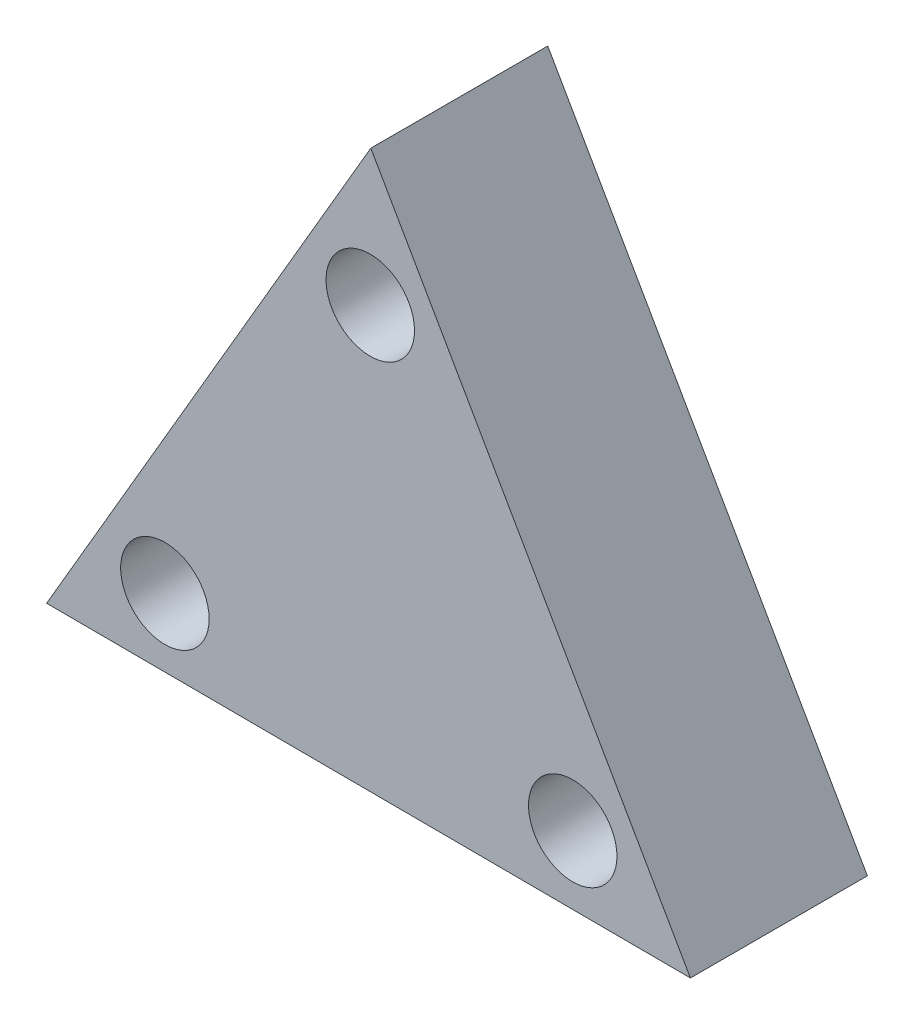
ISO-10303-21;
HEADER;
FILE_DESCRIPTION(('STEP AP214'),'2;1');
FILE_NAME('part.step','',(''),(''),'','','');
FILE_SCHEMA(('AUTOMOTIVE_DESIGN { 1 0 10303 214 1 1 1 1 }'));
ENDSEC;
DATA;
#1=APPLICATION_CONTEXT('core data for automotive mechanical design processes');
#2=APPLICATION_PROTOCOL_DEFINITION('international standard','automotive_design',2000,#1);
#3=PRODUCT_CONTEXT('',#1,'mechanical');
#4=PRODUCT('Part','Part','',(#3));
#5=PRODUCT_RELATED_PRODUCT_CATEGORY('part','',(#4));
#6=PRODUCT_DEFINITION_FORMATION('','',#4);
#7=PRODUCT_DEFINITION_CONTEXT('part definition',#1,'design');
#8=PRODUCT_DEFINITION('design','',#6,#7);
#9=PRODUCT_DEFINITION_SHAPE('','',#8);
#10=(LENGTH_UNIT() NAMED_UNIT(*) SI_UNIT(.MILLI.,.METRE.));
#11=(NAMED_UNIT(*) PLANE_ANGLE_UNIT() SI_UNIT($,.RADIAN.));
#12=(NAMED_UNIT(*) SI_UNIT($,.STERADIAN.) SOLID_ANGLE_UNIT());
#13=UNCERTAINTY_MEASURE_WITH_UNIT(LENGTH_MEASURE(1.E-05),#10,'distance_accuracy_value','');
#14=(GEOMETRIC_REPRESENTATION_CONTEXT(3) GLOBAL_UNCERTAINTY_ASSIGNED_CONTEXT((#13)) GLOBAL_UNIT_ASSIGNED_CONTEXT((#10,
#11,#12)) REPRESENTATION_CONTEXT('',''));
#15=CARTESIAN_POINT('',(0.,0.,0.));
#16=DIRECTION('',(0.,0.,1.));
#17=DIRECTION('',(1.,0.,0.));
#18=AXIS2_PLACEMENT_3D('',#15,#16,#17);
#19=CARTESIAN_POINT('',(10.8817140815096,-6.33832176780794,6.));
#20=DIRECTION('',(-0.868075666515462,-0.496431905908289,0.));
#21=DIRECTION('',(0.496431905908289,-0.868075666515462,0.));
#22=AXIS2_PLACEMENT_3D('',#19,#20,#21);
#23=PLANE('',#22);
#24=DIRECTION('',(-0.496431905908289,0.868075666515462,0.));
#25=VECTOR('',#24,1.);
#26=CARTESIAN_POINT('',(10.8817140815096,-6.33832176780794,0.));
#27=LINE('',#26,#25);
#28=CARTESIAN_POINT('',(10.8817140815096,-6.33832176780794,0.));
#29=VERTEX_POINT('',#28);
#30=CARTESIAN_POINT('',(0.0446055755316642,12.6117700322246,0.));
#31=VERTEX_POINT('',#30);
#32=EDGE_CURVE('E82',#29,#31,#27,.T.);
#33=ORIENTED_EDGE('',*,*,#32,.T.);
#34=DIRECTION('',(0.,0.,-1.));
#35=VECTOR('',#34,1.);
#36=CARTESIAN_POINT('',(0.0446055755316642,12.6117700322246,6.));
#37=LINE('',#36,#35);
#38=CARTESIAN_POINT('',(0.0446055755316642,12.6117700322246,6.));
#39=VERTEX_POINT('',#38);
#40=EDGE_CURVE('E11',#39,#31,#37,.T.);
#41=ORIENTED_EDGE('',*,*,#40,.F.);
#42=DIRECTION('',(-0.496431905908289,0.868075666515462,0.));
#43=VECTOR('',#42,1.);
#44=CARTESIAN_POINT('',(10.8817140815096,-6.33832176780794,6.));
#45=LINE('',#44,#43);
#46=CARTESIAN_POINT('',(10.8817140815096,-6.33832176780794,6.));
#47=VERTEX_POINT('',#46);
#48=EDGE_CURVE('E75',#47,#39,#45,.T.);
#49=ORIENTED_EDGE('',*,*,#48,.F.);
#50=DIRECTION('',(0.,0.,-1.));
#51=VECTOR('',#50,1.);
#52=CARTESIAN_POINT('',(10.8817140815096,-6.33832176780794,6.));
#53=LINE('',#52,#51);
#54=EDGE_CURVE('E83',#47,#29,#53,.T.);
#55=ORIENTED_EDGE('',*,*,#54,.T.);
#56=EDGE_LOOP('',(#33,#41,#49,#55));
#57=FACE_BOUND('',#56,.T.);
#58=ADVANCED_FACE('F33',(#57),#23,.F.);
#59=CARTESIAN_POINT('',(0.0446055755316642,12.6117700322246,6.));
#60=DIRECTION('',(0.863960475023436,-0.503559626655353,0.));
#61=DIRECTION('',(0.503559626655353,0.863960475023437,0.));
#62=AXIS2_PLACEMENT_3D('',#59,#60,#61);
#63=PLANE('',#62);
#64=DIRECTION('',(-0.503559626655353,-0.863960475023436,0.));
#65=VECTOR('',#64,1.);
#66=CARTESIAN_POINT('',(0.0446055755316642,12.6117700322246,0.));
#67=LINE('',#66,#65);
#68=CARTESIAN_POINT('',(-10.9481010743546,-6.24848713753694,0.));
#69=VERTEX_POINT('',#68);
#70=EDGE_CURVE('E63',#31,#69,#67,.T.);
#71=ORIENTED_EDGE('',*,*,#70,.T.);
#72=DIRECTION('',(0.,0.,-1.));
#73=VECTOR('',#72,1.);
#74=CARTESIAN_POINT('',(-10.9481010743546,-6.24848713753694,6.));
#75=LINE('',#74,#73);
#76=CARTESIAN_POINT('',(-10.9481010743546,-6.24848713753694,6.));
#77=VERTEX_POINT('',#76);
#78=EDGE_CURVE('E42',#77,#69,#75,.T.);
#79=ORIENTED_EDGE('',*,*,#78,.F.);
#80=DIRECTION('',(-0.503559626655353,-0.863960475023436,0.));
#81=VECTOR('',#80,1.);
#82=CARTESIAN_POINT('',(0.0446055755316642,12.6117700322246,6.));
#83=LINE('',#82,#81);
#84=EDGE_CURVE('E71',#39,#77,#83,.T.);
#85=ORIENTED_EDGE('',*,*,#84,.F.);
#86=ORIENTED_EDGE('',*,*,#40,.T.);
#87=EDGE_LOOP('',(#71,#79,#85,#86));
#88=FACE_BOUND('',#87,.T.);
#89=ADVANCED_FACE('F72',(#88),#63,.F.);
#90=CARTESIAN_POINT('',(-10.9481010743546,-6.24848713753694,6.));
#91=DIRECTION('',(0.00411519149202929,0.999991532563643,0.));
#92=DIRECTION('',(-0.999991532563643,0.00411519149202929,0.));
#93=AXIS2_PLACEMENT_3D('',#90,#91,#92);
#94=PLANE('',#93);
#95=DIRECTION('',(0.999991532563643,-0.00411519149202929,0.));
#96=VECTOR('',#95,1.);
#97=CARTESIAN_POINT('',(-10.9481010743546,-6.24848713753694,0.));
#98=LINE('',#97,#96);
#99=EDGE_CURVE('E68',#69,#29,#98,.T.);
#100=ORIENTED_EDGE('',*,*,#99,.T.);
#101=ORIENTED_EDGE('',*,*,#54,.F.);
#102=DIRECTION('',(0.999991532563643,-0.00411519149202929,0.));
#103=VECTOR('',#102,1.);
#104=CARTESIAN_POINT('',(-10.9481010743546,-6.24848713753694,6.));
#105=LINE('',#104,#103);
#106=EDGE_CURVE('E51',#77,#47,#105,.T.);
#107=ORIENTED_EDGE('',*,*,#106,.F.);
#108=ORIENTED_EDGE('',*,*,#78,.T.);
#109=EDGE_LOOP('',(#100,#101,#107,#108));
#110=FACE_BOUND('',#109,.T.);
#111=ADVANCED_FACE('F117',(#110),#94,.F.);
#112=CARTESIAN_POINT('',(0.,0.,6.));
#113=DIRECTION('',(0.,0.,1.));
#114=DIRECTION('',(1.,0.,0.));
#115=AXIS2_PLACEMENT_3D('',#112,#113,#114);
#116=PLANE('',#115);
#117=CARTESIAN_POINT('',(6.89102232648509,-4.01037201158161,6.));
#118=DIRECTION('',(0.,0.,1.));
#119=DIRECTION('',(1.,0.,0.));
#120=AXIS2_PLACEMENT_3D('',#117,#118,#119);
#121=CIRCLE('',#120,1.5);
#122=CARTESIAN_POINT('',(8.39102232648509,-4.01037201158161,6.));
#123=VERTEX_POINT('',#122);
#124=EDGE_CURVE('E97',#123,#123,#121,.T.);
#125=ORIENTED_EDGE('',*,*,#124,.F.);
#126=EDGE_LOOP('',(#125));
#127=FACE_BOUND('',#126,.T.);
#128=CARTESIAN_POINT('',(-6.93777480146451,-3.9550493429843,6.));
#129=DIRECTION('',(0.,0.,1.));
#130=DIRECTION('',(1.,0.,0.));
#131=AXIS2_PLACEMENT_3D('',#128,#129,#130);
#132=CIRCLE('',#131,1.5);
#133=CARTESIAN_POINT('',(-5.43777480146451,-3.9550493429843,6.));
#134=VERTEX_POINT('',#133);
#135=EDGE_CURVE('E102',#134,#134,#132,.T.);
#136=ORIENTED_EDGE('',*,*,#135,.F.);
#137=EDGE_LOOP('',(#136));
#138=FACE_BOUND('',#137,.T.);
#139=CARTESIAN_POINT('',(0.0258418270888683,7.99116097286046,6.));
#140=DIRECTION('',(0.,0.,1.));
#141=DIRECTION('',(1.,0.,0.));
#142=AXIS2_PLACEMENT_3D('',#139,#140,#141);
#143=CIRCLE('',#142,1.5);
#144=CARTESIAN_POINT('',(1.52584182708887,7.99116097286046,6.));
#145=VERTEX_POINT('',#144);
#146=EDGE_CURVE('E89',#145,#145,#143,.T.);
#147=ORIENTED_EDGE('',*,*,#146,.F.);
#148=EDGE_LOOP('',(#147));
#149=FACE_BOUND('',#148,.T.);
#150=ORIENTED_EDGE('',*,*,#48,.T.);
#151=ORIENTED_EDGE('',*,*,#84,.T.);
#152=ORIENTED_EDGE('',*,*,#106,.T.);
#153=EDGE_LOOP('',(#150,#151,#152));
#154=FACE_BOUND('',#153,.T.);
#155=ADVANCED_FACE('F78',(#127,#138,#149,#154),#116,.T.);
#156=CARTESIAN_POINT('',(0.,0.,0.));
#157=DIRECTION('',(0.,0.,1.));
#158=DIRECTION('',(1.,0.,0.));
#159=AXIS2_PLACEMENT_3D('',#156,#157,#158);
#160=PLANE('',#159);
#161=CARTESIAN_POINT('',(6.89102232648509,-4.01037201158161,0.));
#162=DIRECTION('',(0.,0.,1.));
#163=DIRECTION('',(1.,0.,0.));
#164=AXIS2_PLACEMENT_3D('',#161,#162,#163);
#165=CIRCLE('',#164,1.5);
#166=CARTESIAN_POINT('',(8.39102232648509,-4.01037201158161,0.));
#167=VERTEX_POINT('',#166);
#168=EDGE_CURVE('E36',#167,#167,#165,.T.);
#169=ORIENTED_EDGE('',*,*,#168,.T.);
#170=EDGE_LOOP('',(#169));
#171=FACE_BOUND('',#170,.T.);
#172=CARTESIAN_POINT('',(-6.93777480146451,-3.9550493429843,0.));
#173=DIRECTION('',(0.,0.,1.));
#174=DIRECTION('',(1.,0.,0.));
#175=AXIS2_PLACEMENT_3D('',#172,#173,#174);
#176=CIRCLE('',#175,1.5);
#177=CARTESIAN_POINT('',(-5.43777480146451,-3.9550493429843,0.));
#178=VERTEX_POINT('',#177);
#179=EDGE_CURVE('E95',#178,#178,#176,.T.);
#180=ORIENTED_EDGE('',*,*,#179,.T.);
#181=EDGE_LOOP('',(#180));
#182=FACE_BOUND('',#181,.T.);
#183=CARTESIAN_POINT('',(0.0258418270888683,7.99116097286046,0.));
#184=DIRECTION('',(0.,0.,1.));
#185=DIRECTION('',(1.,0.,0.));
#186=AXIS2_PLACEMENT_3D('',#183,#184,#185);
#187=CIRCLE('',#186,1.5);
#188=CARTESIAN_POINT('',(1.52584182708887,7.99116097286046,0.));
#189=VERTEX_POINT('',#188);
#190=EDGE_CURVE('E85',#189,#189,#187,.T.);
#191=ORIENTED_EDGE('',*,*,#190,.T.);
#192=EDGE_LOOP('',(#191));
#193=FACE_BOUND('',#192,.T.);
#194=ORIENTED_EDGE('',*,*,#32,.F.);
#195=ORIENTED_EDGE('',*,*,#99,.F.);
#196=ORIENTED_EDGE('',*,*,#70,.F.);
#197=EDGE_LOOP('',(#194,#195,#196));
#198=FACE_BOUND('',#197,.T.);
#199=ADVANCED_FACE('F116',(#171,#182,#193,#198),#160,.F.);
#200=CARTESIAN_POINT('',(0.0258418270888683,7.99116097286046,-2.));
#201=DIRECTION('',(0.,0.,1.));
#202=DIRECTION('',(1.,0.,0.));
#203=AXIS2_PLACEMENT_3D('',#200,#201,#202);
#204=CYLINDRICAL_SURFACE('',#203,1.5);
#205=ORIENTED_EDGE('',*,*,#146,.T.);
#206=EDGE_LOOP('',(#205));
#207=FACE_BOUND('',#206,.T.);
#208=ORIENTED_EDGE('',*,*,#190,.F.);
#209=EDGE_LOOP('',(#208));
#210=FACE_BOUND('',#209,.T.);
#211=ADVANCED_FACE('F112',(#207,#210),#204,.F.);
#212=CARTESIAN_POINT('',(-6.93777480146451,-3.9550493429843,-2.));
#213=DIRECTION('',(0.,0.,1.));
#214=DIRECTION('',(1.,0.,0.));
#215=AXIS2_PLACEMENT_3D('',#212,#213,#214);
#216=CYLINDRICAL_SURFACE('',#215,1.5);
#217=ORIENTED_EDGE('',*,*,#135,.T.);
#218=EDGE_LOOP('',(#217));
#219=FACE_BOUND('',#218,.T.);
#220=ORIENTED_EDGE('',*,*,#179,.F.);
#221=EDGE_LOOP('',(#220));
#222=FACE_BOUND('',#221,.T.);
#223=ADVANCED_FACE('F158',(#219,#222),#216,.F.);
#224=CARTESIAN_POINT('',(6.89102232648509,-4.01037201158161,-2.));
#225=DIRECTION('',(0.,0.,1.));
#226=DIRECTION('',(1.,0.,0.));
#227=AXIS2_PLACEMENT_3D('',#224,#225,#226);
#228=CYLINDRICAL_SURFACE('',#227,1.5);
#229=ORIENTED_EDGE('',*,*,#124,.T.);
#230=EDGE_LOOP('',(#229));
#231=FACE_BOUND('',#230,.T.);
#232=ORIENTED_EDGE('',*,*,#168,.F.);
#233=EDGE_LOOP('',(#232));
#234=FACE_BOUND('',#233,.T.);
#235=ADVANCED_FACE('F166',(#231,#234),#228,.F.);
#236=CLOSED_SHELL('',(#58,#89,#111,#155,#199,#211,#223,#235));
#237=MANIFOLD_SOLID_BREP('B2',#236);
#238=ADVANCED_BREP_SHAPE_REPRESENTATION('',(#18,#237),#14);
#239=SHAPE_DEFINITION_REPRESENTATION(#9,#238);
ENDSEC;
END-ISO-10303-21;
